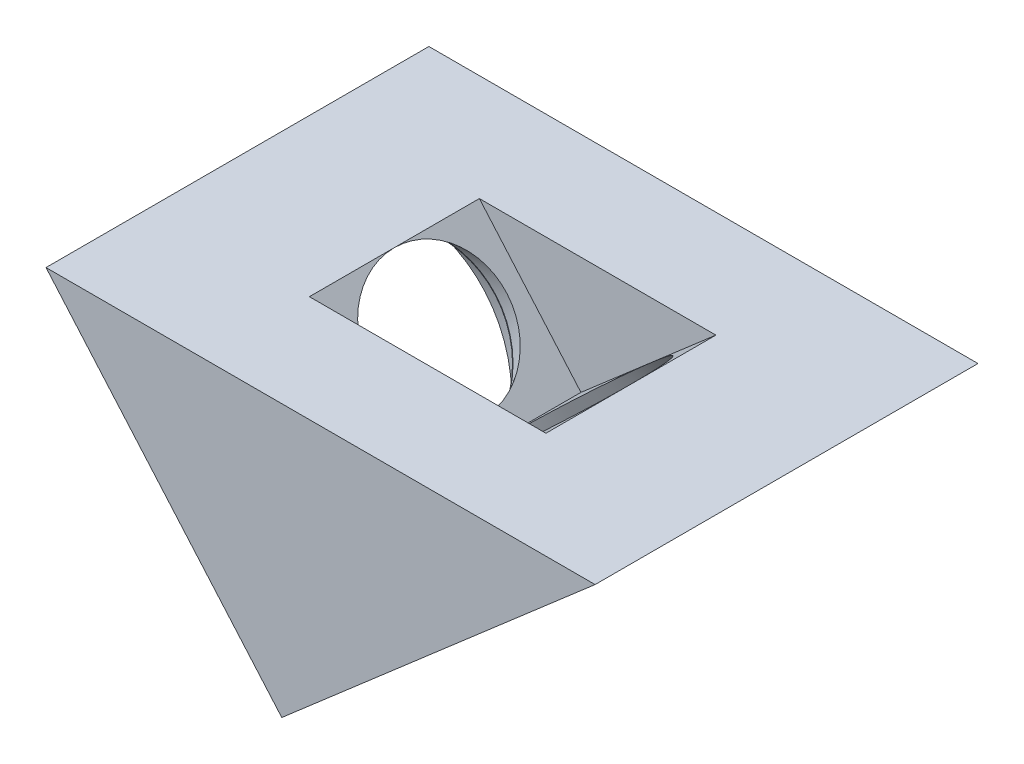
ISO-10303-21;
HEADER;
FILE_DESCRIPTION(('STEP AP214'),'2;1');
FILE_NAME('part.step','',(''),(''),'','','');
FILE_SCHEMA(('AUTOMOTIVE_DESIGN { 1 0 10303 214 1 1 1 1 }'));
ENDSEC;
DATA;
#1=APPLICATION_CONTEXT('core data for automotive mechanical design processes');
#2=APPLICATION_PROTOCOL_DEFINITION('international standard','automotive_design',2000,#1);
#3=PRODUCT_CONTEXT('',#1,'mechanical');
#4=PRODUCT('Part','Part','',(#3));
#5=PRODUCT_RELATED_PRODUCT_CATEGORY('part','',(#4));
#6=PRODUCT_DEFINITION_FORMATION('','',#4);
#7=PRODUCT_DEFINITION_CONTEXT('part definition',#1,'design');
#8=PRODUCT_DEFINITION('design','',#6,#7);
#9=PRODUCT_DEFINITION_SHAPE('','',#8);
#10=(LENGTH_UNIT() NAMED_UNIT(*) SI_UNIT(.MILLI.,.METRE.));
#11=(NAMED_UNIT(*) PLANE_ANGLE_UNIT() SI_UNIT($,.RADIAN.));
#12=(NAMED_UNIT(*) SI_UNIT($,.STERADIAN.) SOLID_ANGLE_UNIT());
#13=UNCERTAINTY_MEASURE_WITH_UNIT(LENGTH_MEASURE(1.E-05),#10,'distance_accuracy_value','');
#14=(GEOMETRIC_REPRESENTATION_CONTEXT(3) GLOBAL_UNCERTAINTY_ASSIGNED_CONTEXT((#13)) GLOBAL_UNIT_ASSIGNED_CONTEXT((#10,
#11,#12)) REPRESENTATION_CONTEXT('',''));
#15=CARTESIAN_POINT('',(0.,0.,0.));
#16=DIRECTION('',(0.,0.,1.));
#17=DIRECTION('',(1.,0.,0.));
#18=AXIS2_PLACEMENT_3D('',#15,#16,#17);
#19=CARTESIAN_POINT('',(4.79715322184099,-4.9585383731311,30.0406466168224));
#20=DIRECTION('',(0.65525361589476,-0.755408961329453,0.));
#21=DIRECTION('',(0.755408961329453,0.65525361589476,0.));
#22=AXIS2_PLACEMENT_3D('',#19,#20,#21);
#23=PLANE('',#22);
#24=DIRECTION('',(0.,0.,-1.));
#25=VECTOR('',#24,1.);
#26=CARTESIAN_POINT('',(10.5136029007098,0.,30.0406466168224));
#27=LINE('',#26,#25);
#28=CARTESIAN_POINT('',(10.5136029007098,0.,7.1515687842698));
#29=VERTEX_POINT('',#28);
#30=CARTESIAN_POINT('',(10.5136029007098,0.,-7.15156878426981));
#31=VERTEX_POINT('',#30);
#32=EDGE_CURVE('E13',#29,#31,#27,.T.);
#33=ORIENTED_EDGE('',*,*,#32,.F.);
#34=DIRECTION('',(-0.755408961329453,-0.65525361589476,0.));
#35=VECTOR('',#34,1.);
#36=CARTESIAN_POINT('',(4.79715322184099,-4.9585383731311,7.15156878426981));
#37=LINE('',#36,#35);
#38=CARTESIAN_POINT('',(-1.19233482182882,-10.1539145188761,7.15156878426981));
#39=VERTEX_POINT('',#38);
#40=EDGE_CURVE('E82',#29,#39,#37,.T.);
#41=ORIENTED_EDGE('',*,*,#40,.T.);
#42=DIRECTION('',(0.,0.,-1.));
#43=VECTOR('',#42,1.);
#44=CARTESIAN_POINT('',(-1.19233482182882,-10.1539145188761,30.0406466168224));
#45=LINE('',#44,#43);
#46=CARTESIAN_POINT('',(-1.19233482182882,-10.1539145188761,-7.15156878426981));
#47=VERTEX_POINT('',#46);
#48=EDGE_CURVE('E174',#39,#47,#45,.T.);
#49=ORIENTED_EDGE('',*,*,#48,.T.);
#50=DIRECTION('',(-0.755408961329453,-0.65525361589476,0.));
#51=VECTOR('',#50,1.);
#52=CARTESIAN_POINT('',(4.79715322184099,-4.9585383731311,-7.15156878426981));
#53=LINE('',#52,#51);
#54=EDGE_CURVE('E168',#31,#47,#53,.T.);
#55=ORIENTED_EDGE('',*,*,#54,.F.);
#56=EDGE_LOOP('',(#33,#41,#49,#55));
#57=FACE_BOUND('',#56,.T.);
#58=CARTESIAN_POINT('',(4.79715322184099,-4.95853837313109,0.));
#59=DIRECTION('',(-0.65525361589476,0.755408961329453,0.));
#60=DIRECTION('',(0.,0.,-1.));
#61=AXIS2_PLACEMENT_3D('',#58,#59,#60);
#62=CIRCLE('',#61,5.842);
#63=CARTESIAN_POINT('',(4.79715322184099,-4.95853837313109,-5.842));
#64=VERTEX_POINT('',#63);
#65=EDGE_CURVE('E160',#64,#64,#62,.T.);
#66=ORIENTED_EDGE('',*,*,#65,.T.);
#67=EDGE_LOOP('',(#66));
#68=FACE_BOUND('',#67,.T.);
#69=ADVANCED_FACE('F44',(#57,#68),#23,.T.);
#70=CARTESIAN_POINT('',(5.45240683773575,0.,30.0406466168224));
#71=DIRECTION('',(0.,1.,0.));
#72=DIRECTION('',(-1.,0.,0.));
#73=AXIS2_PLACEMENT_3D('',#70,#71,#72);
#74=PLANE('',#73);
#75=DIRECTION('',(0.,0.,-1.));
#76=VECTOR('',#75,1.);
#77=CARTESIAN_POINT('',(-10.,0.,30.0406466168224));
#78=LINE('',#77,#76);
#79=CARTESIAN_POINT('',(-10.,0.,7.15156878426981));
#80=VERTEX_POINT('',#79);
#81=CARTESIAN_POINT('',(-10.,0.,-7.15156878426981));
#82=VERTEX_POINT('',#81);
#83=EDGE_CURVE('E176',#80,#82,#78,.T.);
#84=ORIENTED_EDGE('',*,*,#83,.F.);
#85=DIRECTION('',(1.,0.,0.));
#86=VECTOR('',#85,1.);
#87=CARTESIAN_POINT('',(5.45240683773575,0.,7.15156878426981));
#88=LINE('',#87,#86);
#89=EDGE_CURVE('E52',#80,#29,#88,.T.);
#90=ORIENTED_EDGE('',*,*,#89,.T.);
#91=ORIENTED_EDGE('',*,*,#32,.T.);
#92=DIRECTION('',(1.,0.,0.));
#93=VECTOR('',#92,1.);
#94=CARTESIAN_POINT('',(5.45240683773575,0.,-7.15156878426981));
#95=LINE('',#94,#93);
#96=EDGE_CURVE('E164',#82,#31,#95,.T.);
#97=ORIENTED_EDGE('',*,*,#96,.F.);
#98=EDGE_LOOP('',(#84,#90,#91,#97));
#99=FACE_BOUND('',#98,.T.);
#100=DIRECTION('',(0.,0.,1.));
#101=VECTOR('',#100,1.);
#102=CARTESIAN_POINT('',(-4.13721285540184,0.,0.));
#103=LINE('',#102,#101);
#104=CARTESIAN_POINT('',(-4.13721285540184,0.,0.));
#105=VERTEX_POINT('',#104);
#106=CARTESIAN_POINT('',(-4.13721285540184,0.,3.175));
#107=VERTEX_POINT('',#106);
#108=EDGE_CURVE('E137',#105,#107,#103,.T.);
#109=ORIENTED_EDGE('',*,*,#108,.F.);
#110=CARTESIAN_POINT('',(-4.13721285540182,0.,-3.175));
#111=VERTEX_POINT('',#110);
#112=EDGE_CURVE('E121',#111,#105,#103,.T.);
#113=ORIENTED_EDGE('',*,*,#112,.F.);
#114=DIRECTION('',(-1.,0.,0.));
#115=VECTOR('',#114,1.);
#116=CARTESIAN_POINT('',(8.35952650847887,0.,-3.175));
#117=LINE('',#116,#115);
#118=CARTESIAN_POINT('',(4.69906039750298,0.,-3.175));
#119=VERTEX_POINT('',#118);
#120=EDGE_CURVE('E131',#119,#111,#117,.T.);
#121=ORIENTED_EDGE('',*,*,#120,.F.);
#122=DIRECTION('',(0.,0.,1.));
#123=VECTOR('',#122,1.);
#124=CARTESIAN_POINT('',(4.69906039750298,0.,0.));
#125=LINE('',#124,#123);
#126=CARTESIAN_POINT('',(4.69906039750297,0.,0.));
#127=VERTEX_POINT('',#126);
#128=EDGE_CURVE('E146',#119,#127,#125,.T.);
#129=ORIENTED_EDGE('',*,*,#128,.T.);
#130=CARTESIAN_POINT('',(4.69906039750298,0.,3.175));
#131=VERTEX_POINT('',#130);
#132=EDGE_CURVE('E127',#127,#131,#125,.T.);
#133=ORIENTED_EDGE('',*,*,#132,.T.);
#134=DIRECTION('',(-1.,0.,0.));
#135=VECTOR('',#134,1.);
#136=CARTESIAN_POINT('',(8.35952650847887,0.,3.175));
#137=LINE('',#136,#135);
#138=EDGE_CURVE('E149',#131,#107,#137,.T.);
#139=ORIENTED_EDGE('',*,*,#138,.T.);
#140=EDGE_LOOP('',(#109,#113,#121,#129,#133,#139));
#141=FACE_BOUND('',#140,.T.);
#142=ADVANCED_FACE('F140',(#99,#141),#74,.T.);
#143=CARTESIAN_POINT('',(5.45240683773575,-5.71394733446055,7.15156878426981));
#144=DIRECTION('',(0.,0.,1.));
#145=DIRECTION('',(-0.65525361589476,0.755408961329453,0.));
#146=AXIS2_PLACEMENT_3D('',#143,#144,#145);
#147=PLANE('',#146);
#148=ORIENTED_EDGE('',*,*,#89,.F.);
#149=DIRECTION('',(-0.65525361589476,0.755408961329453,0.));
#150=VECTOR('',#149,1.);
#151=CARTESIAN_POINT('',(-0.537081205934064,-10.9093234802056,7.15156878426981));
#152=LINE('',#151,#150);
#153=EDGE_CURVE('E86',#39,#80,#152,.T.);
#154=ORIENTED_EDGE('',*,*,#153,.F.);
#155=ORIENTED_EDGE('',*,*,#40,.F.);
#156=EDGE_LOOP('',(#148,#154,#155));
#157=FACE_BOUND('',#156,.T.);
#158=ADVANCED_FACE('F46',(#157),#147,.T.);
#159=CARTESIAN_POINT('',(0.,0.,-7.15156878426981));
#160=DIRECTION('',(0.,0.,1.));
#161=DIRECTION('',(0.,-1.,0.));
#162=AXIS2_PLACEMENT_3D('',#159,#160,#161);
#163=PLANE('',#162);
#164=ORIENTED_EDGE('',*,*,#96,.T.);
#165=ORIENTED_EDGE('',*,*,#54,.T.);
#166=DIRECTION('',(-0.65525361589476,0.755408961329453,0.));
#167=VECTOR('',#166,1.);
#168=CARTESIAN_POINT('',(-0.537081205934061,-10.9093234802056,-7.15156878426981));
#169=LINE('',#168,#167);
#170=EDGE_CURVE('E165',#47,#82,#169,.T.);
#171=ORIENTED_EDGE('',*,*,#170,.T.);
#172=EDGE_LOOP('',(#164,#165,#171));
#173=FACE_BOUND('',#172,.T.);
#174=ADVANCED_FACE('F183',(#173),#163,.F.);
#175=CARTESIAN_POINT('',(-0.537081205934061,-10.9093234802056,30.0406466168224));
#176=DIRECTION('',(-0.755408961329453,-0.65525361589476,0.));
#177=DIRECTION('',(0.65525361589476,-0.755408961329453,0.));
#178=AXIS2_PLACEMENT_3D('',#175,#176,#177);
#179=PLANE('',#178);
#180=CARTESIAN_POINT('',(-5.81842535004584,-4.82072725189018,0.));
#181=DIRECTION('',(0.755408961329453,0.65525361589476,0.));
#182=DIRECTION('',(0.,0.,-1.));
#183=AXIS2_PLACEMENT_3D('',#180,#181,#182);
#184=CIRCLE('',#183,5.07578312380431);
#185=CARTESIAN_POINT('',(-5.81842535004584,-4.82072725189018,-5.07578312380431));
#186=VERTEX_POINT('',#185);
#187=EDGE_CURVE('E206',#186,#186,#184,.T.);
#188=ORIENTED_EDGE('',*,*,#187,.T.);
#189=EDGE_LOOP('',(#188));
#190=FACE_BOUND('',#189,.T.);
#191=ORIENTED_EDGE('',*,*,#48,.F.);
#192=ORIENTED_EDGE('',*,*,#153,.T.);
#193=ORIENTED_EDGE('',*,*,#83,.T.);
#194=ORIENTED_EDGE('',*,*,#170,.F.);
#195=EDGE_LOOP('',(#191,#192,#193,#194));
#196=FACE_BOUND('',#195,.T.);
#197=ADVANCED_FACE('F184',(#190,#196),#179,.T.);
#198=CARTESIAN_POINT('',(2.30063694528195,-2.08043023046587,0.));
#199=DIRECTION('',(0.65525361589476,-0.755408961329453,0.));
#200=DIRECTION('',(0.,0.,1.));
#201=AXIS2_PLACEMENT_3D('',#198,#199,#200);
#202=CONICAL_SURFACE('',#201,3.175,0.610725964389208);
#203=ORIENTED_EDGE('',*,*,#65,.F.);
#204=EDGE_LOOP('',(#203));
#205=FACE_BOUND('',#204,.T.);
#206=CARTESIAN_POINT('',(2.30063694528195,-2.08043023046587,0.));
#207=DIRECTION('',(0.65525361589476,-0.755408961329453,0.));
#208=DIRECTION('',(0.,0.,1.));
#209=AXIS2_PLACEMENT_3D('',#206,#207,#208);
#210=CIRCLE('',#209,3.175);
#211=CARTESIAN_POINT('',(2.30063694528195,-2.08043023046587,3.175));
#212=VERTEX_POINT('',#211);
#213=EDGE_CURVE('E157',#127,#212,#210,.T.);
#214=ORIENTED_EDGE('',*,*,#213,.F.);
#215=CARTESIAN_POINT('',(2.30063694528195,-2.08043023046587,-3.175));
#216=VERTEX_POINT('',#215);
#217=EDGE_CURVE('E151',#216,#127,#210,.T.);
#218=ORIENTED_EDGE('',*,*,#217,.F.);
#219=EDGE_CURVE('E161',#212,#216,#210,.T.);
#220=ORIENTED_EDGE('',*,*,#219,.F.);
#221=EDGE_LOOP('',(#214,#218,#220));
#222=FACE_BOUND('',#221,.T.);
#223=ADVANCED_FACE('F196',(#205,#222),#202,.F.);
#224=CARTESIAN_POINT('',(10.3771023986594,4.92522294931773,0.));
#225=DIRECTION('',(0.65525361589476,-0.755408961329453,0.));
#226=DIRECTION('',(-0.755408961329453,-0.65525361589476,0.));
#227=AXIS2_PLACEMENT_3D('',#224,#225,#226);
#228=PLANE('',#227);
#229=ORIENTED_EDGE('',*,*,#213,.T.);
#230=DIRECTION('',(-0.755408961329453,-0.65525361589476,0.));
#231=VECTOR('',#230,1.);
#232=CARTESIAN_POINT('',(10.3771023986594,4.92522294931773,3.175));
#233=LINE('',#232,#231);
#234=EDGE_CURVE('E152',#131,#212,#233,.T.);
#235=ORIENTED_EDGE('',*,*,#234,.F.);
#236=ORIENTED_EDGE('',*,*,#132,.F.);
#237=EDGE_LOOP('',(#229,#235,#236));
#238=FACE_BOUND('',#237,.T.);
#239=ADVANCED_FACE('F202',(#238),#228,.F.);
#240=ORIENTED_EDGE('',*,*,#219,.T.);
#241=DIRECTION('',(-0.755408961329453,-0.65525361589476,0.));
#242=VECTOR('',#241,1.);
#243=CARTESIAN_POINT('',(10.3771023986594,4.92522294931773,-3.175));
#244=LINE('',#243,#242);
#245=CARTESIAN_POINT('',(-0.343294419371158,-4.37381788609755,-3.175));
#246=VERTEX_POINT('',#245);
#247=EDGE_CURVE('E156',#216,#246,#244,.T.);
#248=ORIENTED_EDGE('',*,*,#247,.T.);
#249=DIRECTION('',(0.,0.,1.));
#250=VECTOR('',#249,1.);
#251=CARTESIAN_POINT('',(-0.343294419371157,-4.37381788609755,0.));
#252=LINE('',#251,#250);
#253=CARTESIAN_POINT('',(-0.343294419371157,-4.37381788609755,3.175));
#254=VERTEX_POINT('',#253);
#255=EDGE_CURVE('E124',#246,#254,#252,.T.);
#256=ORIENTED_EDGE('',*,*,#255,.T.);
#257=EDGE_CURVE('E148',#212,#254,#233,.T.);
#258=ORIENTED_EDGE('',*,*,#257,.F.);
#259=EDGE_LOOP('',(#240,#248,#256,#258));
#260=FACE_BOUND('',#259,.T.);
#261=ADVANCED_FACE('F222',(#260),#228,.F.);
#262=CARTESIAN_POINT('',(-2.36087030955173,-2.04785604379093,0.));
#263=DIRECTION('',(0.755408961329453,0.65525361589476,0.));
#264=DIRECTION('',(0.65525361589476,-0.755408961329453,0.));
#265=AXIS2_PLACEMENT_3D('',#262,#263,#264);
#266=PLANE('',#265);
#267=ORIENTED_EDGE('',*,*,#108,.T.);
#268=DIRECTION('',(-0.65525361589476,0.755408961329453,0.));
#269=VECTOR('',#268,1.);
#270=CARTESIAN_POINT('',(-2.36087030955173,-2.04785604379093,3.175));
#271=LINE('',#270,#269);
#272=EDGE_CURVE('E59',#254,#107,#271,.T.);
#273=ORIENTED_EDGE('',*,*,#272,.F.);
#274=ORIENTED_EDGE('',*,*,#255,.F.);
#275=DIRECTION('',(-0.65525361589476,0.755408961329453,0.));
#276=VECTOR('',#275,1.);
#277=CARTESIAN_POINT('',(-2.36087030955173,-2.04785604379093,-3.175));
#278=LINE('',#277,#276);
#279=EDGE_CURVE('E117',#246,#111,#278,.T.);
#280=ORIENTED_EDGE('',*,*,#279,.T.);
#281=ORIENTED_EDGE('',*,*,#112,.T.);
#282=CARTESIAN_POINT('',(-2.47286867102914,-1.91873876177683,0.));
#283=DIRECTION('',(-0.755408961329453,-0.65525361589476,0.));
#284=DIRECTION('',(0.,0.,-1.));
#285=AXIS2_PLACEMENT_3D('',#282,#283,#284);
#286=CIRCLE('',#285,2.53999999999999);
#287=EDGE_CURVE('E208',#105,#105,#286,.T.);
#288=ORIENTED_EDGE('',*,*,#287,.T.);
#289=EDGE_LOOP('',(#267,#273,#274,#280,#281,#288));
#290=FACE_BOUND('',#289,.T.);
#291=ADVANCED_FACE('F119',(#290),#266,.T.);
#292=CARTESIAN_POINT('',(8.35952650847887,7.25118479162435,-3.175));
#293=DIRECTION('',(0.,0.,1.));
#294=DIRECTION('',(1.,0.,0.));
#295=AXIS2_PLACEMENT_3D('',#292,#293,#294);
#296=PLANE('',#295);
#297=ORIENTED_EDGE('',*,*,#120,.T.);
#298=ORIENTED_EDGE('',*,*,#279,.F.);
#299=ORIENTED_EDGE('',*,*,#247,.F.);
#300=EDGE_CURVE('E128',#119,#216,#244,.T.);
#301=ORIENTED_EDGE('',*,*,#300,.F.);
#302=EDGE_LOOP('',(#297,#298,#299,#301));
#303=FACE_BOUND('',#302,.T.);
#304=ADVANCED_FACE('F132',(#303),#296,.T.);
#305=ORIENTED_EDGE('',*,*,#217,.T.);
#306=ORIENTED_EDGE('',*,*,#128,.F.);
#307=ORIENTED_EDGE('',*,*,#300,.T.);
#308=EDGE_LOOP('',(#305,#306,#307));
#309=FACE_BOUND('',#308,.T.);
#310=ADVANCED_FACE('F225',(#309),#228,.F.);
#311=CARTESIAN_POINT('',(8.35952650847887,7.25118479162435,3.175));
#312=DIRECTION('',(0.,0.,1.));
#313=DIRECTION('',(1.,0.,0.));
#314=AXIS2_PLACEMENT_3D('',#311,#312,#313);
#315=PLANE('',#314);
#316=ORIENTED_EDGE('',*,*,#234,.T.);
#317=ORIENTED_EDGE('',*,*,#257,.T.);
#318=ORIENTED_EDGE('',*,*,#272,.T.);
#319=ORIENTED_EDGE('',*,*,#138,.F.);
#320=EDGE_LOOP('',(#316,#317,#318,#319));
#321=FACE_BOUND('',#320,.T.);
#322=ADVANCED_FACE('F230',(#321),#315,.F.);
#323=CARTESIAN_POINT('',(-10.9691969997076,-9.28858760418102,0.));
#324=DIRECTION('',(-0.755408961329453,-0.65525361589476,0.));
#325=DIRECTION('',(0.,0.,-1.));
#326=AXIS2_PLACEMENT_3D('',#323,#324,#325);
#327=CONICAL_SURFACE('',#326,9.27099999999999,0.551570317209836);
#328=CARTESIAN_POINT('',(-3.643299315713,-2.93398871424418,0.));
#329=DIRECTION('',(-0.755408961329453,-0.65525361589476,0.));
#330=DIRECTION('',(0.,0.,-1.));
#331=AXIS2_PLACEMENT_3D('',#328,#329,#330);
#332=CIRCLE('',#331,3.3041795529714);
#333=CARTESIAN_POINT('',(-3.643299315713,-2.93398871424418,-3.3041795529714));
#334=VERTEX_POINT('',#333);
#335=EDGE_CURVE('E209',#334,#334,#332,.T.);
#336=ORIENTED_EDGE('',*,*,#335,.F.);
#337=EDGE_LOOP('',(#336));
#338=FACE_BOUND('',#337,.T.);
#339=ORIENTED_EDGE('',*,*,#187,.F.);
#340=EDGE_LOOP('',(#339));
#341=FACE_BOUND('',#340,.T.);
#342=ADVANCED_FACE('F232',(#338,#341),#327,.F.);
#343=CARTESIAN_POINT('',(-3.62411192809523,-2.91734527240044,0.));
#344=DIRECTION('',(-0.755408961329453,-0.65525361589476,0.));
#345=DIRECTION('',(0.,0.,-1.));
#346=AXIS2_PLACEMENT_3D('',#343,#344,#345);
#347=CONICAL_SURFACE('',#346,3.2787795529714,0.451384268790544);
#348=ORIENTED_EDGE('',*,*,#287,.F.);
#349=EDGE_LOOP('',(#348));
#350=FACE_BOUND('',#349,.T.);
#351=CARTESIAN_POINT('',(-3.62411192809523,-2.91734527240044,0.));
#352=DIRECTION('',(-0.755408961329453,-0.65525361589476,0.));
#353=DIRECTION('',(0.,0.,-1.));
#354=AXIS2_PLACEMENT_3D('',#351,#352,#353);
#355=CIRCLE('',#354,3.2787795529714);
#356=CARTESIAN_POINT('',(-3.62411192809523,-2.91734527240044,-3.2787795529714));
#357=VERTEX_POINT('',#356);
#358=EDGE_CURVE('E211',#357,#357,#355,.T.);
#359=ORIENTED_EDGE('',*,*,#358,.T.);
#360=EDGE_LOOP('',(#359));
#361=FACE_BOUND('',#360,.T.);
#362=ADVANCED_FACE('F238',(#350,#361),#347,.F.);
#363=CARTESIAN_POINT('',(-65.5324101303171,-56.6175769714062,0.));
#364=DIRECTION('',(-0.755408961329453,-0.65525361589476,0.));
#365=DIRECTION('',(0.,0.,-1.));
#366=AXIS2_PLACEMENT_3D('',#363,#364,#365);
#367=CYLINDRICAL_SURFACE('',#366,3.2787795529714);
#368=ORIENTED_EDGE('',*,*,#358,.F.);
#369=EDGE_LOOP('',(#368));
#370=FACE_BOUND('',#369,.T.);
#371=CARTESIAN_POINT('',(-3.643299315713,-2.93398871424418,0.));
#372=DIRECTION('',(-0.755408961329453,-0.65525361589476,0.));
#373=DIRECTION('',(0.,0.,-1.));
#374=AXIS2_PLACEMENT_3D('',#371,#372,#373);
#375=CIRCLE('',#374,3.2787795529714);
#376=CARTESIAN_POINT('',(-3.643299315713,-2.93398871424418,-3.2787795529714));
#377=VERTEX_POINT('',#376);
#378=EDGE_CURVE('E138',#377,#377,#375,.T.);
#379=ORIENTED_EDGE('',*,*,#378,.T.);
#380=EDGE_LOOP('',(#379));
#381=FACE_BOUND('',#380,.T.);
#382=ADVANCED_FACE('F334',(#370,#381),#367,.F.);
#383=CARTESIAN_POINT('',(-3.643299315713,-2.93398871424418,-3.3041795529714));
#384=DIRECTION('',(0.755408961329453,0.65525361589476,0.));
#385=DIRECTION('',(0.,0.,1.));
#386=AXIS2_PLACEMENT_3D('',#383,#384,#385);
#387=PLANE('',#386);
#388=ORIENTED_EDGE('',*,*,#378,.F.);
#389=EDGE_LOOP('',(#388));
#390=FACE_BOUND('',#389,.T.);
#391=ORIENTED_EDGE('',*,*,#335,.T.);
#392=EDGE_LOOP('',(#391));
#393=FACE_BOUND('',#392,.T.);
#394=ADVANCED_FACE('F343',(#390,#393),#387,.F.);
#395=CLOSED_SHELL('',(#69,#142,#158,#174,#197,#223,#239,#261,#291,#304,#310,#322,#342,#362,#382,#394));
#396=MANIFOLD_SOLID_BREP('B2',#395);
#397=ADVANCED_BREP_SHAPE_REPRESENTATION('',(#18,#396),#14);
#398=SHAPE_DEFINITION_REPRESENTATION(#9,#397);
ENDSEC;
END-ISO-10303-21;
